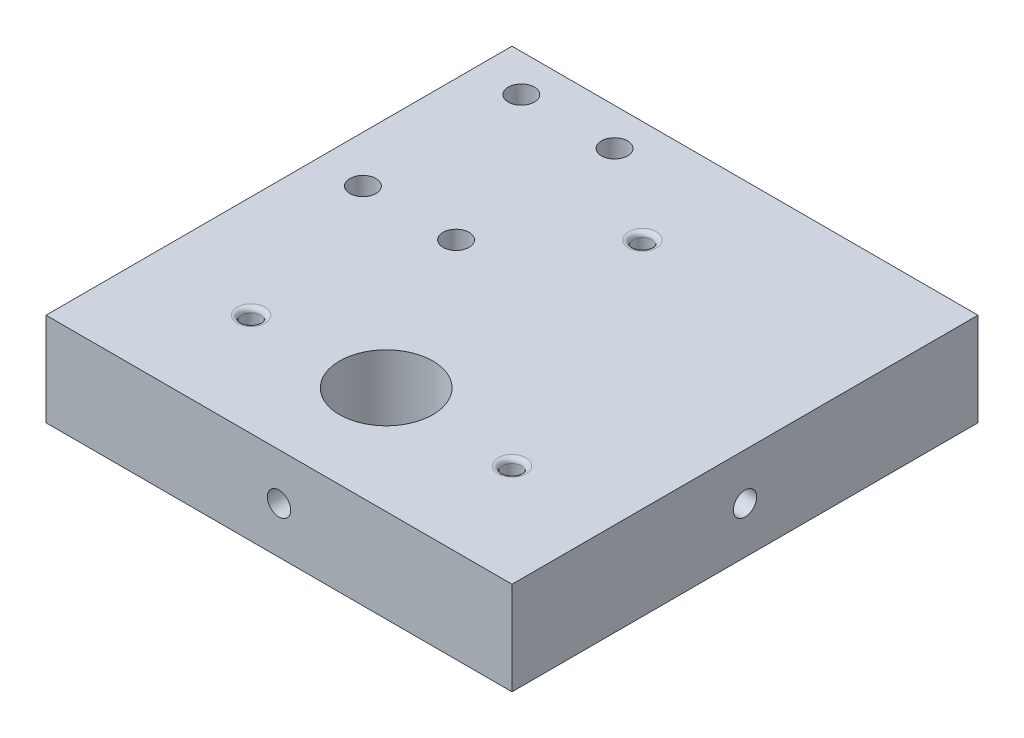
ISO-10303-21;
HEADER;
FILE_DESCRIPTION(('STEP AP214'),'2;1');
FILE_NAME('part.step','',(''),(''),'','','');
FILE_SCHEMA(('AUTOMOTIVE_DESIGN { 1 0 10303 214 1 1 1 1 }'));
ENDSEC;
DATA;
#1=APPLICATION_CONTEXT('core data for automotive mechanical design processes');
#2=APPLICATION_PROTOCOL_DEFINITION('international standard','automotive_design',2000,#1);
#3=PRODUCT_CONTEXT('',#1,'mechanical');
#4=PRODUCT('Part','Part','',(#3));
#5=PRODUCT_RELATED_PRODUCT_CATEGORY('part','',(#4));
#6=PRODUCT_DEFINITION_FORMATION('','',#4);
#7=PRODUCT_DEFINITION_CONTEXT('part definition',#1,'design');
#8=PRODUCT_DEFINITION('design','',#6,#7);
#9=PRODUCT_DEFINITION_SHAPE('','',#8);
#10=(LENGTH_UNIT() NAMED_UNIT(*) SI_UNIT(.MILLI.,.METRE.));
#11=(NAMED_UNIT(*) PLANE_ANGLE_UNIT() SI_UNIT($,.RADIAN.));
#12=(NAMED_UNIT(*) SI_UNIT($,.STERADIAN.) SOLID_ANGLE_UNIT());
#13=UNCERTAINTY_MEASURE_WITH_UNIT(LENGTH_MEASURE(1.E-05),#10,'distance_accuracy_value','');
#14=(GEOMETRIC_REPRESENTATION_CONTEXT(3) GLOBAL_UNCERTAINTY_ASSIGNED_CONTEXT((#13)) GLOBAL_UNIT_ASSIGNED_CONTEXT((#10,
#11,#12)) REPRESENTATION_CONTEXT('',''));
#15=CARTESIAN_POINT('',(0.,0.,0.));
#16=DIRECTION('',(0.,0.,1.));
#17=DIRECTION('',(1.,0.,0.));
#18=AXIS2_PLACEMENT_3D('',#15,#16,#17);
#19=CARTESIAN_POINT('',(0.,10.,0.));
#20=DIRECTION('',(1.,0.,0.));
#21=DIRECTION('',(0.,0.,-1.));
#22=AXIS2_PLACEMENT_3D('',#19,#20,#21);
#23=PLANE('',#22);
#24=CARTESIAN_POINT('',(0.,5.,-25.0002146716261));
#25=DIRECTION('',(-1.,0.,0.));
#26=DIRECTION('',(0.,0.,1.));
#27=AXIS2_PLACEMENT_3D('',#24,#25,#26);
#28=CIRCLE('',#27,1.25);
#29=CARTESIAN_POINT('',(0.,5.,-23.750214671626));
#30=VERTEX_POINT('',#29);
#31=EDGE_CURVE('E416',#30,#30,#28,.T.);
#32=ORIENTED_EDGE('',*,*,#31,.F.);
#33=EDGE_LOOP('',(#32));
#34=FACE_BOUND('',#33,.T.);
#35=DIRECTION('',(0.,0.,1.));
#36=VECTOR('',#35,1.);
#37=CARTESIAN_POINT('',(0.,0.,0.));
#38=LINE('',#37,#36);
#39=CARTESIAN_POINT('',(0.,0.,-50.));
#40=VERTEX_POINT('',#39);
#41=CARTESIAN_POINT('',(0.,0.,0.));
#42=VERTEX_POINT('',#41);
#43=EDGE_CURVE('E161',#40,#42,#38,.T.);
#44=ORIENTED_EDGE('',*,*,#43,.T.);
#45=DIRECTION('',(0.,-1.,0.));
#46=VECTOR('',#45,1.);
#47=CARTESIAN_POINT('',(0.,10.,0.));
#48=LINE('',#47,#46);
#49=CARTESIAN_POINT('',(0.,10.,0.));
#50=VERTEX_POINT('',#49);
#51=EDGE_CURVE('E184',#50,#42,#48,.T.);
#52=ORIENTED_EDGE('',*,*,#51,.F.);
#53=DIRECTION('',(0.,0.,1.));
#54=VECTOR('',#53,1.);
#55=CARTESIAN_POINT('',(0.,10.,0.));
#56=LINE('',#55,#54);
#57=CARTESIAN_POINT('',(0.,10.,-50.));
#58=VERTEX_POINT('',#57);
#59=EDGE_CURVE('E164',#58,#50,#56,.T.);
#60=ORIENTED_EDGE('',*,*,#59,.F.);
#61=DIRECTION('',(0.,-1.,0.));
#62=VECTOR('',#61,1.);
#63=CARTESIAN_POINT('',(0.,10.,-50.));
#64=LINE('',#63,#62);
#65=EDGE_CURVE('E170',#58,#40,#64,.T.);
#66=ORIENTED_EDGE('',*,*,#65,.T.);
#67=EDGE_LOOP('',(#44,#52,#60,#66));
#68=FACE_BOUND('',#67,.T.);
#69=ADVANCED_FACE('F36',(#34,#68),#23,.F.);
#70=CARTESIAN_POINT('',(0.,10.,0.));
#71=DIRECTION('',(0.,0.,-1.));
#72=DIRECTION('',(-1.,0.,0.));
#73=AXIS2_PLACEMENT_3D('',#70,#71,#72);
#74=PLANE('',#73);
#75=CARTESIAN_POINT('',(25.,5.,0.));
#76=DIRECTION('',(0.,0.,1.));
#77=DIRECTION('',(1.,0.,0.));
#78=AXIS2_PLACEMENT_3D('',#75,#76,#77);
#79=CIRCLE('',#78,1.25);
#80=CARTESIAN_POINT('',(26.25,5.,0.));
#81=VERTEX_POINT('',#80);
#82=EDGE_CURVE('E402',#81,#81,#79,.T.);
#83=ORIENTED_EDGE('',*,*,#82,.F.);
#84=EDGE_LOOP('',(#83));
#85=FACE_BOUND('',#84,.T.);
#86=DIRECTION('',(1.,0.,0.));
#87=VECTOR('',#86,1.);
#88=CARTESIAN_POINT('',(0.,0.,0.));
#89=LINE('',#88,#87);
#90=CARTESIAN_POINT('',(50.,0.,0.));
#91=VERTEX_POINT('',#90);
#92=EDGE_CURVE('E173',#42,#91,#89,.T.);
#93=ORIENTED_EDGE('',*,*,#92,.T.);
#94=DIRECTION('',(0.,-1.,0.));
#95=VECTOR('',#94,1.);
#96=CARTESIAN_POINT('',(50.,10.,0.));
#97=LINE('',#96,#95);
#98=CARTESIAN_POINT('',(50.,10.,0.));
#99=VERTEX_POINT('',#98);
#100=EDGE_CURVE('E181',#99,#91,#97,.T.);
#101=ORIENTED_EDGE('',*,*,#100,.F.);
#102=DIRECTION('',(1.,0.,0.));
#103=VECTOR('',#102,1.);
#104=CARTESIAN_POINT('',(0.,10.,0.));
#105=LINE('',#104,#103);
#106=EDGE_CURVE('E88',#50,#99,#105,.T.);
#107=ORIENTED_EDGE('',*,*,#106,.F.);
#108=ORIENTED_EDGE('',*,*,#51,.T.);
#109=EDGE_LOOP('',(#93,#101,#107,#108));
#110=FACE_BOUND('',#109,.T.);
#111=ADVANCED_FACE('F217',(#85,#110),#74,.F.);
#112=CARTESIAN_POINT('',(50.,10.,0.));
#113=DIRECTION('',(-1.,0.,0.));
#114=DIRECTION('',(0.,0.,1.));
#115=AXIS2_PLACEMENT_3D('',#112,#113,#114);
#116=PLANE('',#115);
#117=CARTESIAN_POINT('',(50.,5.,-25.0002146716261));
#118=DIRECTION('',(1.,0.,0.));
#119=DIRECTION('',(0.,0.,-1.));
#120=AXIS2_PLACEMENT_3D('',#117,#118,#119);
#121=CIRCLE('',#120,1.25);
#122=CARTESIAN_POINT('',(50.,5.,-26.2502146716261));
#123=VERTEX_POINT('',#122);
#124=EDGE_CURVE('E411',#123,#123,#121,.T.);
#125=ORIENTED_EDGE('',*,*,#124,.F.);
#126=EDGE_LOOP('',(#125));
#127=FACE_BOUND('',#126,.T.);
#128=DIRECTION('',(0.,0.,-1.));
#129=VECTOR('',#128,1.);
#130=CARTESIAN_POINT('',(50.,0.,0.));
#131=LINE('',#130,#129);
#132=CARTESIAN_POINT('',(50.,0.,-50.));
#133=VERTEX_POINT('',#132);
#134=EDGE_CURVE('E175',#91,#133,#131,.T.);
#135=ORIENTED_EDGE('',*,*,#134,.T.);
#136=DIRECTION('',(0.,-1.,0.));
#137=VECTOR('',#136,1.);
#138=CARTESIAN_POINT('',(50.,10.,-50.));
#139=LINE('',#138,#137);
#140=CARTESIAN_POINT('',(50.,10.,-50.));
#141=VERTEX_POINT('',#140);
#142=EDGE_CURVE('E179',#141,#133,#139,.T.);
#143=ORIENTED_EDGE('',*,*,#142,.F.);
#144=DIRECTION('',(0.,0.,-1.));
#145=VECTOR('',#144,1.);
#146=CARTESIAN_POINT('',(50.,10.,0.));
#147=LINE('',#146,#145);
#148=EDGE_CURVE('E167',#99,#141,#147,.T.);
#149=ORIENTED_EDGE('',*,*,#148,.F.);
#150=ORIENTED_EDGE('',*,*,#100,.T.);
#151=EDGE_LOOP('',(#135,#143,#149,#150));
#152=FACE_BOUND('',#151,.T.);
#153=ADVANCED_FACE('F223',(#127,#152),#116,.F.);
#154=CARTESIAN_POINT('',(0.,10.,-50.));
#155=DIRECTION('',(0.,0.,1.));
#156=DIRECTION('',(1.,0.,0.));
#157=AXIS2_PLACEMENT_3D('',#154,#155,#156);
#158=PLANE('',#157);
#159=CARTESIAN_POINT('',(25.,5.,-50.));
#160=DIRECTION('',(0.,0.,-1.));
#161=DIRECTION('',(-1.,0.,0.));
#162=AXIS2_PLACEMENT_3D('',#159,#160,#161);
#163=CIRCLE('',#162,1.25);
#164=CARTESIAN_POINT('',(23.75,5.,-50.));
#165=VERTEX_POINT('',#164);
#166=EDGE_CURVE('E401',#165,#165,#163,.T.);
#167=ORIENTED_EDGE('',*,*,#166,.F.);
#168=EDGE_LOOP('',(#167));
#169=FACE_BOUND('',#168,.T.);
#170=DIRECTION('',(-1.,0.,0.));
#171=VECTOR('',#170,1.);
#172=CARTESIAN_POINT('',(0.,0.,-50.));
#173=LINE('',#172,#171);
#174=EDGE_CURVE('E80',#133,#40,#173,.T.);
#175=ORIENTED_EDGE('',*,*,#174,.T.);
#176=ORIENTED_EDGE('',*,*,#65,.F.);
#177=DIRECTION('',(-1.,0.,0.));
#178=VECTOR('',#177,1.);
#179=CARTESIAN_POINT('',(0.,10.,-50.));
#180=LINE('',#179,#178);
#181=EDGE_CURVE('E59',#141,#58,#180,.T.);
#182=ORIENTED_EDGE('',*,*,#181,.F.);
#183=ORIENTED_EDGE('',*,*,#142,.T.);
#184=EDGE_LOOP('',(#175,#176,#182,#183));
#185=FACE_BOUND('',#184,.T.);
#186=ADVANCED_FACE('F231',(#169,#185),#158,.F.);
#187=CARTESIAN_POINT('',(0.,10.,0.));
#188=DIRECTION('',(0.,-1.,0.));
#189=DIRECTION('',(0.,0.,-1.));
#190=AXIS2_PLACEMENT_3D('',#187,#188,#189);
#191=PLANE('',#190);
#192=CARTESIAN_POINT('',(25.,10.,-39.));
#193=DIRECTION('',(0.,-1.,0.));
#194=DIRECTION('',(0.,0.,-1.));
#195=AXIS2_PLACEMENT_3D('',#192,#193,#194);
#196=CIRCLE('',#195,1.5);
#197=CARTESIAN_POINT('',(25.,10.,-40.5));
#198=VERTEX_POINT('',#197);
#199=EDGE_CURVE('E195',#198,#198,#196,.T.);
#200=ORIENTED_EDGE('',*,*,#199,.T.);
#201=EDGE_LOOP('',(#200));
#202=FACE_BOUND('',#201,.T.);
#203=CARTESIAN_POINT('',(11.,10.,-11.));
#204=DIRECTION('',(0.,-1.,0.));
#205=DIRECTION('',(0.,0.,-1.));
#206=AXIS2_PLACEMENT_3D('',#203,#204,#205);
#207=CIRCLE('',#206,1.5);
#208=CARTESIAN_POINT('',(11.,10.,-12.5));
#209=VERTEX_POINT('',#208);
#210=EDGE_CURVE('E192',#209,#209,#207,.T.);
#211=ORIENTED_EDGE('',*,*,#210,.T.);
#212=EDGE_LOOP('',(#211));
#213=FACE_BOUND('',#212,.T.);
#214=CARTESIAN_POINT('',(39.,10.,-11.));
#215=DIRECTION('',(0.,-1.,0.));
#216=DIRECTION('',(0.,0.,-1.));
#217=AXIS2_PLACEMENT_3D('',#214,#215,#216);
#218=CIRCLE('',#217,1.5);
#219=CARTESIAN_POINT('',(39.,10.,-12.5));
#220=VERTEX_POINT('',#219);
#221=EDGE_CURVE('E189',#220,#220,#218,.T.);
#222=ORIENTED_EDGE('',*,*,#221,.T.);
#223=EDGE_LOOP('',(#222));
#224=FACE_BOUND('',#223,.T.);
#225=CARTESIAN_POINT('',(5.,10.,-29.));
#226=DIRECTION('',(0.,1.,0.));
#227=DIRECTION('',(0.,0.,1.));
#228=AXIS2_PLACEMENT_3D('',#225,#226,#227);
#229=CIRCLE('',#228,1.4);
#230=CARTESIAN_POINT('',(5.,10.,-27.6));
#231=VERTEX_POINT('',#230);
#232=EDGE_CURVE('E451',#231,#231,#229,.T.);
#233=ORIENTED_EDGE('',*,*,#232,.F.);
#234=EDGE_LOOP('',(#233));
#235=FACE_BOUND('',#234,.T.);
#236=CARTESIAN_POINT('',(15.,10.,-46.));
#237=DIRECTION('',(0.,1.,0.));
#238=DIRECTION('',(0.,0.,1.));
#239=AXIS2_PLACEMENT_3D('',#236,#237,#238);
#240=CIRCLE('',#239,1.4);
#241=CARTESIAN_POINT('',(15.,10.,-44.6));
#242=VERTEX_POINT('',#241);
#243=EDGE_CURVE('E117',#242,#242,#240,.T.);
#244=ORIENTED_EDGE('',*,*,#243,.F.);
#245=EDGE_LOOP('',(#244));
#246=FACE_BOUND('',#245,.T.);
#247=CARTESIAN_POINT('',(5.,10.,-46.));
#248=DIRECTION('',(0.,1.,0.));
#249=DIRECTION('',(0.,0.,1.));
#250=AXIS2_PLACEMENT_3D('',#247,#248,#249);
#251=CIRCLE('',#250,1.4);
#252=CARTESIAN_POINT('',(5.,10.,-44.6));
#253=VERTEX_POINT('',#252);
#254=EDGE_CURVE('E103',#253,#253,#251,.T.);
#255=ORIENTED_EDGE('',*,*,#254,.F.);
#256=EDGE_LOOP('',(#255));
#257=FACE_BOUND('',#256,.T.);
#258=CARTESIAN_POINT('',(15.,10.,-29.));
#259=DIRECTION('',(0.,1.,0.));
#260=DIRECTION('',(0.,0.,1.));
#261=AXIS2_PLACEMENT_3D('',#258,#259,#260);
#262=CIRCLE('',#261,1.4);
#263=CARTESIAN_POINT('',(15.,10.,-27.6));
#264=VERTEX_POINT('',#263);
#265=EDGE_CURVE('E107',#264,#264,#262,.T.);
#266=ORIENTED_EDGE('',*,*,#265,.F.);
#267=EDGE_LOOP('',(#266));
#268=FACE_BOUND('',#267,.T.);
#269=CARTESIAN_POINT('',(25.,10.,-11.5));
#270=DIRECTION('',(0.,-1.,0.));
#271=DIRECTION('',(0.,0.,-1.));
#272=AXIS2_PLACEMENT_3D('',#269,#270,#271);
#273=CIRCLE('',#272,5.);
#274=CARTESIAN_POINT('',(25.,10.,-16.5));
#275=VERTEX_POINT('',#274);
#276=EDGE_CURVE('E152',#275,#275,#273,.T.);
#277=ORIENTED_EDGE('',*,*,#276,.T.);
#278=EDGE_LOOP('',(#277));
#279=FACE_BOUND('',#278,.T.);
#280=ORIENTED_EDGE('',*,*,#59,.T.);
#281=ORIENTED_EDGE('',*,*,#106,.T.);
#282=ORIENTED_EDGE('',*,*,#148,.T.);
#283=ORIENTED_EDGE('',*,*,#181,.T.);
#284=EDGE_LOOP('',(#280,#281,#282,#283));
#285=FACE_BOUND('',#284,.T.);
#286=ADVANCED_FACE('F235',(#202,#213,#224,#235,#246,#257,#268,#279,#285),#191,.F.);
#287=CARTESIAN_POINT('',(0.,0.,0.));
#288=DIRECTION('',(0.,-1.,0.));
#289=DIRECTION('',(0.,0.,-1.));
#290=AXIS2_PLACEMENT_3D('',#287,#288,#289);
#291=PLANE('',#290);
#292=CARTESIAN_POINT('',(32.5,0.,-29.));
#293=DIRECTION('',(0.,-1.,0.));
#294=DIRECTION('',(0.,0.,-1.));
#295=AXIS2_PLACEMENT_3D('',#292,#293,#294);
#296=CIRCLE('',#295,1.25);
#297=CARTESIAN_POINT('',(32.5,0.,-30.25));
#298=VERTEX_POINT('',#297);
#299=EDGE_CURVE('E434',#298,#298,#296,.T.);
#300=ORIENTED_EDGE('',*,*,#299,.F.);
#301=EDGE_LOOP('',(#300));
#302=FACE_BOUND('',#301,.T.);
#303=CARTESIAN_POINT('',(17.5,0.,-45.));
#304=DIRECTION('',(0.,-1.,0.));
#305=DIRECTION('',(0.,0.,-1.));
#306=AXIS2_PLACEMENT_3D('',#303,#304,#305);
#307=CIRCLE('',#306,1.25);
#308=CARTESIAN_POINT('',(17.5,0.,-46.25));
#309=VERTEX_POINT('',#308);
#310=EDGE_CURVE('E428',#309,#309,#307,.T.);
#311=ORIENTED_EDGE('',*,*,#310,.F.);
#312=EDGE_LOOP('',(#311));
#313=FACE_BOUND('',#312,.T.);
#314=CARTESIAN_POINT('',(32.5,0.,-45.));
#315=DIRECTION('',(0.,-1.,0.));
#316=DIRECTION('',(0.,0.,-1.));
#317=AXIS2_PLACEMENT_3D('',#314,#315,#316);
#318=CIRCLE('',#317,1.25);
#319=CARTESIAN_POINT('',(32.5,0.,-46.25));
#320=VERTEX_POINT('',#319);
#321=EDGE_CURVE('E422',#320,#320,#318,.T.);
#322=ORIENTED_EDGE('',*,*,#321,.F.);
#323=EDGE_LOOP('',(#322));
#324=FACE_BOUND('',#323,.T.);
#325=CARTESIAN_POINT('',(17.5,0.,-29.));
#326=DIRECTION('',(0.,-1.,0.));
#327=DIRECTION('',(0.,0.,-1.));
#328=AXIS2_PLACEMENT_3D('',#325,#326,#327);
#329=CIRCLE('',#328,1.25);
#330=CARTESIAN_POINT('',(17.5,0.,-30.25));
#331=VERTEX_POINT('',#330);
#332=EDGE_CURVE('E96',#331,#331,#329,.T.);
#333=ORIENTED_EDGE('',*,*,#332,.F.);
#334=EDGE_LOOP('',(#333));
#335=FACE_BOUND('',#334,.T.);
#336=CARTESIAN_POINT('',(40.,0.,-4.6));
#337=DIRECTION('',(0.,-1.,0.));
#338=DIRECTION('',(0.,0.,-1.));
#339=AXIS2_PLACEMENT_3D('',#336,#337,#338);
#340=CIRCLE('',#339,1.25);
#341=CARTESIAN_POINT('',(40.,0.,-5.85));
#342=VERTEX_POINT('',#341);
#343=EDGE_CURVE('E129',#342,#342,#340,.T.);
#344=ORIENTED_EDGE('',*,*,#343,.F.);
#345=EDGE_LOOP('',(#344));
#346=FACE_BOUND('',#345,.T.);
#347=CARTESIAN_POINT('',(10.,0.,-18.4));
#348=DIRECTION('',(0.,-1.,0.));
#349=DIRECTION('',(0.,0.,-1.));
#350=AXIS2_PLACEMENT_3D('',#347,#348,#349);
#351=CIRCLE('',#350,1.25);
#352=CARTESIAN_POINT('',(10.,0.,-19.65));
#353=VERTEX_POINT('',#352);
#354=EDGE_CURVE('E123',#353,#353,#351,.T.);
#355=ORIENTED_EDGE('',*,*,#354,.F.);
#356=EDGE_LOOP('',(#355));
#357=FACE_BOUND('',#356,.T.);
#358=CARTESIAN_POINT('',(10.,0.,-4.6));
#359=DIRECTION('',(0.,-1.,0.));
#360=DIRECTION('',(0.,0.,-1.));
#361=AXIS2_PLACEMENT_3D('',#358,#359,#360);
#362=CIRCLE('',#361,1.25);
#363=CARTESIAN_POINT('',(10.,0.,-5.85));
#364=VERTEX_POINT('',#363);
#365=EDGE_CURVE('E111',#364,#364,#362,.T.);
#366=ORIENTED_EDGE('',*,*,#365,.F.);
#367=EDGE_LOOP('',(#366));
#368=FACE_BOUND('',#367,.T.);
#369=CARTESIAN_POINT('',(40.,0.,-18.4));
#370=DIRECTION('',(0.,-1.,0.));
#371=DIRECTION('',(0.,0.,-1.));
#372=AXIS2_PLACEMENT_3D('',#369,#370,#371);
#373=CIRCLE('',#372,1.25);
#374=CARTESIAN_POINT('',(40.,0.,-19.65));
#375=VERTEX_POINT('',#374);
#376=EDGE_CURVE('E128',#375,#375,#373,.T.);
#377=ORIENTED_EDGE('',*,*,#376,.F.);
#378=EDGE_LOOP('',(#377));
#379=FACE_BOUND('',#378,.T.);
#380=CARTESIAN_POINT('',(25.,0.,-11.5));
#381=DIRECTION('',(0.,-1.,0.));
#382=DIRECTION('',(0.,0.,-1.));
#383=AXIS2_PLACEMENT_3D('',#380,#381,#382);
#384=CIRCLE('',#383,10.1);
#385=CARTESIAN_POINT('',(25.,0.,-21.6));
#386=VERTEX_POINT('',#385);
#387=EDGE_CURVE('E155',#386,#386,#384,.T.);
#388=ORIENTED_EDGE('',*,*,#387,.F.);
#389=EDGE_LOOP('',(#388));
#390=FACE_BOUND('',#389,.T.);
#391=ORIENTED_EDGE('',*,*,#43,.F.);
#392=ORIENTED_EDGE('',*,*,#174,.F.);
#393=ORIENTED_EDGE('',*,*,#134,.F.);
#394=ORIENTED_EDGE('',*,*,#92,.F.);
#395=EDGE_LOOP('',(#391,#392,#393,#394));
#396=FACE_BOUND('',#395,.T.);
#397=ADVANCED_FACE('F237',(#302,#313,#324,#335,#346,#357,#368,#379,#390,#396),#291,.T.);
#398=CARTESIAN_POINT('',(25.,2.,-11.5));
#399=DIRECTION('',(0.,-1.,0.));
#400=DIRECTION('',(0.,0.,-1.));
#401=AXIS2_PLACEMENT_3D('',#398,#399,#400);
#402=CYLINDRICAL_SURFACE('',#401,10.1);
#403=CARTESIAN_POINT('',(25.,2.,-11.5));
#404=DIRECTION('',(0.,-1.,0.));
#405=DIRECTION('',(0.,0.,-1.));
#406=AXIS2_PLACEMENT_3D('',#403,#404,#405);
#407=CIRCLE('',#406,10.1);
#408=CARTESIAN_POINT('',(25.,2.,-21.6));
#409=VERTEX_POINT('',#408);
#410=EDGE_CURVE('E158',#409,#409,#407,.T.);
#411=ORIENTED_EDGE('',*,*,#410,.F.);
#412=EDGE_LOOP('',(#411));
#413=FACE_BOUND('',#412,.T.);
#414=ORIENTED_EDGE('',*,*,#387,.T.);
#415=EDGE_LOOP('',(#414));
#416=FACE_BOUND('',#415,.T.);
#417=ADVANCED_FACE('F240',(#413,#416),#402,.F.);
#418=CARTESIAN_POINT('',(25.,2.,-11.5));
#419=DIRECTION('',(0.,-1.,0.));
#420=DIRECTION('',(0.,0.,-1.));
#421=AXIS2_PLACEMENT_3D('',#418,#419,#420);
#422=PLANE('',#421);
#423=CARTESIAN_POINT('',(25.,2.,-11.5));
#424=DIRECTION('',(0.,-1.,0.));
#425=DIRECTION('',(0.,0.,-1.));
#426=AXIS2_PLACEMENT_3D('',#423,#424,#425);
#427=CIRCLE('',#426,5.);
#428=CARTESIAN_POINT('',(25.,2.,-16.5));
#429=VERTEX_POINT('',#428);
#430=EDGE_CURVE('E146',#429,#429,#427,.T.);
#431=ORIENTED_EDGE('',*,*,#430,.F.);
#432=EDGE_LOOP('',(#431));
#433=FACE_BOUND('',#432,.T.);
#434=ORIENTED_EDGE('',*,*,#410,.T.);
#435=EDGE_LOOP('',(#434));
#436=FACE_BOUND('',#435,.T.);
#437=ADVANCED_FACE('F247',(#433,#436),#422,.T.);
#438=CARTESIAN_POINT('',(25.,10.,-11.5));
#439=DIRECTION('',(0.,-1.,0.));
#440=DIRECTION('',(0.,0.,-1.));
#441=AXIS2_PLACEMENT_3D('',#438,#439,#440);
#442=CYLINDRICAL_SURFACE('',#441,5.);
#443=ORIENTED_EDGE('',*,*,#276,.F.);
#444=EDGE_LOOP('',(#443));
#445=FACE_BOUND('',#444,.T.);
#446=ORIENTED_EDGE('',*,*,#430,.T.);
#447=EDGE_LOOP('',(#446));
#448=FACE_BOUND('',#447,.T.);
#449=ADVANCED_FACE('F251',(#445,#448),#442,.F.);
#450=CARTESIAN_POINT('',(39.,8.,-11.));
#451=DIRECTION('',(0.,1.,0.));
#452=DIRECTION('',(0.,0.,1.));
#453=AXIS2_PLACEMENT_3D('',#450,#451,#452);
#454=CYLINDRICAL_SURFACE('',#453,0.999999999999998);
#455=CARTESIAN_POINT('',(39.,9.5,-11.));
#456=DIRECTION('',(0.,-1.,0.));
#457=DIRECTION('',(0.,0.,-1.));
#458=AXIS2_PLACEMENT_3D('',#455,#456,#457);
#459=CIRCLE('',#458,0.999999999999998);
#460=CARTESIAN_POINT('',(39.,9.5,-12.));
#461=VERTEX_POINT('',#460);
#462=EDGE_CURVE('E11',#461,#461,#459,.F.);
#463=ORIENTED_EDGE('',*,*,#462,.T.);
#464=EDGE_LOOP('',(#463));
#465=FACE_BOUND('',#464,.T.);
#466=CARTESIAN_POINT('',(39.,8.,-11.));
#467=DIRECTION('',(0.,1.,0.));
#468=DIRECTION('',(0.,0.,1.));
#469=AXIS2_PLACEMENT_3D('',#466,#467,#468);
#470=CIRCLE('',#469,0.999999999999998);
#471=CARTESIAN_POINT('',(39.,8.,-10.));
#472=VERTEX_POINT('',#471);
#473=EDGE_CURVE('E140',#472,#472,#470,.T.);
#474=ORIENTED_EDGE('',*,*,#473,.F.);
#475=EDGE_LOOP('',(#474));
#476=FACE_BOUND('',#475,.T.);
#477=ADVANCED_FACE('F255',(#465,#476),#454,.F.);
#478=CARTESIAN_POINT('',(39.,8.,-11.));
#479=DIRECTION('',(0.,1.,0.));
#480=DIRECTION('',(0.,0.,1.));
#481=AXIS2_PLACEMENT_3D('',#478,#479,#480);
#482=PLANE('',#481);
#483=ORIENTED_EDGE('',*,*,#473,.T.);
#484=EDGE_LOOP('',(#483));
#485=FACE_BOUND('',#484,.T.);
#486=ADVANCED_FACE('F259',(#485),#482,.T.);
#487=CARTESIAN_POINT('',(11.,8.,-11.));
#488=DIRECTION('',(0.,1.,0.));
#489=DIRECTION('',(0.,0.,1.));
#490=AXIS2_PLACEMENT_3D('',#487,#488,#489);
#491=CYLINDRICAL_SURFACE('',#490,1.);
#492=CARTESIAN_POINT('',(11.,9.5,-11.));
#493=DIRECTION('',(0.,-1.,0.));
#494=DIRECTION('',(0.,0.,-1.));
#495=AXIS2_PLACEMENT_3D('',#492,#493,#494);
#496=CIRCLE('',#495,1.);
#497=CARTESIAN_POINT('',(11.,9.5,-12.));
#498=VERTEX_POINT('',#497);
#499=EDGE_CURVE('E44',#498,#498,#496,.F.);
#500=ORIENTED_EDGE('',*,*,#499,.T.);
#501=EDGE_LOOP('',(#500));
#502=FACE_BOUND('',#501,.T.);
#503=CARTESIAN_POINT('',(11.,8.,-11.));
#504=DIRECTION('',(0.,1.,0.));
#505=DIRECTION('',(0.,0.,1.));
#506=AXIS2_PLACEMENT_3D('',#503,#504,#505);
#507=CIRCLE('',#506,1.);
#508=CARTESIAN_POINT('',(11.,8.,-10.));
#509=VERTEX_POINT('',#508);
#510=EDGE_CURVE('E147',#509,#509,#507,.T.);
#511=ORIENTED_EDGE('',*,*,#510,.F.);
#512=EDGE_LOOP('',(#511));
#513=FACE_BOUND('',#512,.T.);
#514=ADVANCED_FACE('F200',(#502,#513),#491,.F.);
#515=CARTESIAN_POINT('',(11.,8.,-11.));
#516=DIRECTION('',(0.,1.,0.));
#517=DIRECTION('',(0.,0.,1.));
#518=AXIS2_PLACEMENT_3D('',#515,#516,#517);
#519=PLANE('',#518);
#520=ORIENTED_EDGE('',*,*,#510,.T.);
#521=EDGE_LOOP('',(#520));
#522=FACE_BOUND('',#521,.T.);
#523=ADVANCED_FACE('F266',(#522),#519,.T.);
#524=CARTESIAN_POINT('',(25.,8.,-39.));
#525=DIRECTION('',(0.,1.,0.));
#526=DIRECTION('',(0.,0.,1.));
#527=AXIS2_PLACEMENT_3D('',#524,#525,#526);
#528=CYLINDRICAL_SURFACE('',#527,1.);
#529=CARTESIAN_POINT('',(25.,9.5,-39.));
#530=DIRECTION('',(0.,-1.,0.));
#531=DIRECTION('',(0.,0.,-1.));
#532=AXIS2_PLACEMENT_3D('',#529,#530,#531);
#533=CIRCLE('',#532,1.);
#534=CARTESIAN_POINT('',(25.,9.5,-40.));
#535=VERTEX_POINT('',#534);
#536=EDGE_CURVE('E186',#535,#535,#533,.F.);
#537=ORIENTED_EDGE('',*,*,#536,.T.);
#538=EDGE_LOOP('',(#537));
#539=FACE_BOUND('',#538,.T.);
#540=CARTESIAN_POINT('',(25.,8.,-39.));
#541=DIRECTION('',(0.,1.,0.));
#542=DIRECTION('',(0.,0.,1.));
#543=AXIS2_PLACEMENT_3D('',#540,#541,#542);
#544=CIRCLE('',#543,1.);
#545=CARTESIAN_POINT('',(25.,8.,-38.));
#546=VERTEX_POINT('',#545);
#547=EDGE_CURVE('E143',#546,#546,#544,.T.);
#548=ORIENTED_EDGE('',*,*,#547,.F.);
#549=EDGE_LOOP('',(#548));
#550=FACE_BOUND('',#549,.T.);
#551=ADVANCED_FACE('F269',(#539,#550),#528,.F.);
#552=CARTESIAN_POINT('',(25.,8.,-39.));
#553=DIRECTION('',(0.,1.,0.));
#554=DIRECTION('',(0.,0.,1.));
#555=AXIS2_PLACEMENT_3D('',#552,#553,#554);
#556=PLANE('',#555);
#557=ORIENTED_EDGE('',*,*,#547,.T.);
#558=EDGE_LOOP('',(#557));
#559=FACE_BOUND('',#558,.T.);
#560=ADVANCED_FACE('F273',(#559),#556,.T.);
#561=CARTESIAN_POINT('',(40.,8.,-18.4));
#562=DIRECTION('',(0.,-1.,0.));
#563=DIRECTION('',(0.,0.,-1.));
#564=AXIS2_PLACEMENT_3D('',#561,#562,#563);
#565=CYLINDRICAL_SURFACE('',#564,1.25);
#566=CARTESIAN_POINT('',(40.,8.,-18.4));
#567=DIRECTION('',(0.,-1.,0.));
#568=DIRECTION('',(0.,0.,-1.));
#569=AXIS2_PLACEMENT_3D('',#566,#567,#568);
#570=CIRCLE('',#569,1.25);
#571=CARTESIAN_POINT('',(40.,8.,-19.65));
#572=VERTEX_POINT('',#571);
#573=EDGE_CURVE('E137',#572,#572,#570,.T.);
#574=ORIENTED_EDGE('',*,*,#573,.F.);
#575=EDGE_LOOP('',(#574));
#576=FACE_BOUND('',#575,.T.);
#577=ORIENTED_EDGE('',*,*,#376,.T.);
#578=EDGE_LOOP('',(#577));
#579=FACE_BOUND('',#578,.T.);
#580=ADVANCED_FACE('F277',(#576,#579),#565,.F.);
#581=CARTESIAN_POINT('',(40.,8.,-18.4));
#582=DIRECTION('',(0.,-1.,0.));
#583=DIRECTION('',(0.,0.,-1.));
#584=AXIS2_PLACEMENT_3D('',#581,#582,#583);
#585=PLANE('',#584);
#586=ORIENTED_EDGE('',*,*,#573,.T.);
#587=EDGE_LOOP('',(#586));
#588=FACE_BOUND('',#587,.T.);
#589=ADVANCED_FACE('F281',(#588),#585,.T.);
#590=CARTESIAN_POINT('',(10.,8.,-4.6));
#591=DIRECTION('',(0.,-1.,0.));
#592=DIRECTION('',(0.,0.,-1.));
#593=AXIS2_PLACEMENT_3D('',#590,#591,#592);
#594=CYLINDRICAL_SURFACE('',#593,1.25);
#595=CARTESIAN_POINT('',(10.,8.,-4.6));
#596=DIRECTION('',(0.,-1.,0.));
#597=DIRECTION('',(0.,0.,-1.));
#598=AXIS2_PLACEMENT_3D('',#595,#596,#597);
#599=CIRCLE('',#598,1.25);
#600=CARTESIAN_POINT('',(10.,8.,-5.85));
#601=VERTEX_POINT('',#600);
#602=EDGE_CURVE('E113',#601,#601,#599,.T.);
#603=ORIENTED_EDGE('',*,*,#602,.F.);
#604=EDGE_LOOP('',(#603));
#605=FACE_BOUND('',#604,.T.);
#606=ORIENTED_EDGE('',*,*,#365,.T.);
#607=EDGE_LOOP('',(#606));
#608=FACE_BOUND('',#607,.T.);
#609=ADVANCED_FACE('F285',(#605,#608),#594,.F.);
#610=CARTESIAN_POINT('',(10.,8.,-4.6));
#611=DIRECTION('',(0.,-1.,0.));
#612=DIRECTION('',(0.,0.,-1.));
#613=AXIS2_PLACEMENT_3D('',#610,#611,#612);
#614=PLANE('',#613);
#615=ORIENTED_EDGE('',*,*,#602,.T.);
#616=EDGE_LOOP('',(#615));
#617=FACE_BOUND('',#616,.T.);
#618=ADVANCED_FACE('F291',(#617),#614,.T.);
#619=CARTESIAN_POINT('',(10.,8.,-18.4));
#620=DIRECTION('',(0.,-1.,0.));
#621=DIRECTION('',(0.,0.,-1.));
#622=AXIS2_PLACEMENT_3D('',#619,#620,#621);
#623=CYLINDRICAL_SURFACE('',#622,1.25);
#624=CARTESIAN_POINT('',(10.,8.,-18.4));
#625=DIRECTION('',(0.,-1.,0.));
#626=DIRECTION('',(0.,0.,-1.));
#627=AXIS2_PLACEMENT_3D('',#624,#625,#626);
#628=CIRCLE('',#627,1.25);
#629=CARTESIAN_POINT('',(10.,8.,-19.65));
#630=VERTEX_POINT('',#629);
#631=EDGE_CURVE('E132',#630,#630,#628,.T.);
#632=ORIENTED_EDGE('',*,*,#631,.F.);
#633=EDGE_LOOP('',(#632));
#634=FACE_BOUND('',#633,.T.);
#635=ORIENTED_EDGE('',*,*,#354,.T.);
#636=EDGE_LOOP('',(#635));
#637=FACE_BOUND('',#636,.T.);
#638=ADVANCED_FACE('F287',(#634,#637),#623,.F.);
#639=CARTESIAN_POINT('',(10.,8.,-18.4));
#640=DIRECTION('',(0.,-1.,0.));
#641=DIRECTION('',(0.,0.,-1.));
#642=AXIS2_PLACEMENT_3D('',#639,#640,#641);
#643=PLANE('',#642);
#644=ORIENTED_EDGE('',*,*,#631,.T.);
#645=EDGE_LOOP('',(#644));
#646=FACE_BOUND('',#645,.T.);
#647=ADVANCED_FACE('F290',(#646),#643,.T.);
#648=CARTESIAN_POINT('',(40.,8.,-4.6));
#649=DIRECTION('',(0.,-1.,0.));
#650=DIRECTION('',(0.,0.,-1.));
#651=AXIS2_PLACEMENT_3D('',#648,#649,#650);
#652=CYLINDRICAL_SURFACE('',#651,1.25);
#653=CARTESIAN_POINT('',(40.,8.,-4.6));
#654=DIRECTION('',(0.,-1.,0.));
#655=DIRECTION('',(0.,0.,-1.));
#656=AXIS2_PLACEMENT_3D('',#653,#654,#655);
#657=CIRCLE('',#656,1.25);
#658=CARTESIAN_POINT('',(40.,8.,-5.85));
#659=VERTEX_POINT('',#658);
#660=EDGE_CURVE('E125',#659,#659,#657,.T.);
#661=ORIENTED_EDGE('',*,*,#660,.F.);
#662=EDGE_LOOP('',(#661));
#663=FACE_BOUND('',#662,.T.);
#664=ORIENTED_EDGE('',*,*,#343,.T.);
#665=EDGE_LOOP('',(#664));
#666=FACE_BOUND('',#665,.T.);
#667=ADVANCED_FACE('F295',(#663,#666),#652,.F.);
#668=CARTESIAN_POINT('',(40.,8.,-4.6));
#669=DIRECTION('',(0.,-1.,0.));
#670=DIRECTION('',(0.,0.,-1.));
#671=AXIS2_PLACEMENT_3D('',#668,#669,#670);
#672=PLANE('',#671);
#673=ORIENTED_EDGE('',*,*,#660,.T.);
#674=EDGE_LOOP('',(#673));
#675=FACE_BOUND('',#674,.T.);
#676=ADVANCED_FACE('F299',(#675),#672,.T.);
#677=CARTESIAN_POINT('',(15.,5.,-29.));
#678=DIRECTION('',(0.,1.,0.));
#679=DIRECTION('',(0.,0.,1.));
#680=AXIS2_PLACEMENT_3D('',#677,#678,#679);
#681=CYLINDRICAL_SURFACE('',#680,1.4);
#682=CARTESIAN_POINT('',(15.,5.,-29.));
#683=DIRECTION('',(0.,1.,0.));
#684=DIRECTION('',(0.,0.,1.));
#685=AXIS2_PLACEMENT_3D('',#682,#683,#684);
#686=CIRCLE('',#685,1.4);
#687=CARTESIAN_POINT('',(16.3295,5.,-28.5613318452406));
#688=VERTEX_POINT('',#687);
#689=CARTESIAN_POINT('',(16.3295,5.,-29.4386681547594));
#690=VERTEX_POINT('',#689);
#691=EDGE_CURVE('E93',#688,#690,#686,.T.);
#692=ORIENTED_EDGE('',*,*,#691,.F.);
#693=EDGE_CURVE('E104',#690,#688,#686,.T.);
#694=ORIENTED_EDGE('',*,*,#693,.F.);
#695=EDGE_LOOP('',(#692,#694));
#696=FACE_BOUND('',#695,.T.);
#697=ORIENTED_EDGE('',*,*,#265,.T.);
#698=EDGE_LOOP('',(#697));
#699=FACE_BOUND('',#698,.T.);
#700=ADVANCED_FACE('F109',(#696,#699),#681,.F.);
#701=CARTESIAN_POINT('',(15.,5.,-29.));
#702=DIRECTION('',(0.,1.,0.));
#703=DIRECTION('',(0.,0.,1.));
#704=AXIS2_PLACEMENT_3D('',#701,#702,#703);
#705=PLANE('',#704);
#706=ORIENTED_EDGE('',*,*,#693,.T.);
#707=CARTESIAN_POINT('',(17.5,5.,-29.));
#708=DIRECTION('',(0.,-1.,0.));
#709=DIRECTION('',(0.,0.,-1.));
#710=AXIS2_PLACEMENT_3D('',#707,#708,#709);
#711=CIRCLE('',#710,1.25);
#712=EDGE_CURVE('E95',#688,#690,#711,.T.);
#713=ORIENTED_EDGE('',*,*,#712,.T.);
#714=EDGE_LOOP('',(#706,#713));
#715=FACE_BOUND('',#714,.T.);
#716=ADVANCED_FACE('F105',(#715),#705,.T.);
#717=CARTESIAN_POINT('',(5.,5.,-46.));
#718=DIRECTION('',(0.,1.,0.));
#719=DIRECTION('',(0.,0.,1.));
#720=AXIS2_PLACEMENT_3D('',#717,#718,#719);
#721=CYLINDRICAL_SURFACE('',#720,1.4);
#722=CARTESIAN_POINT('',(5.,5.,-46.));
#723=DIRECTION('',(0.,1.,0.));
#724=DIRECTION('',(0.,0.,1.));
#725=AXIS2_PLACEMENT_3D('',#722,#723,#724);
#726=CIRCLE('',#725,1.4);
#727=CARTESIAN_POINT('',(5.,5.,-44.6));
#728=VERTEX_POINT('',#727);
#729=EDGE_CURVE('E444',#728,#728,#726,.T.);
#730=ORIENTED_EDGE('',*,*,#729,.F.);
#731=EDGE_LOOP('',(#730));
#732=FACE_BOUND('',#731,.T.);
#733=ORIENTED_EDGE('',*,*,#254,.T.);
#734=EDGE_LOOP('',(#733));
#735=FACE_BOUND('',#734,.T.);
#736=ADVANCED_FACE('F314',(#732,#735),#721,.F.);
#737=CARTESIAN_POINT('',(5.,5.,-46.));
#738=DIRECTION('',(0.,1.,0.));
#739=DIRECTION('',(0.,0.,1.));
#740=AXIS2_PLACEMENT_3D('',#737,#738,#739);
#741=PLANE('',#740);
#742=ORIENTED_EDGE('',*,*,#729,.T.);
#743=EDGE_LOOP('',(#742));
#744=FACE_BOUND('',#743,.T.);
#745=ADVANCED_FACE('F319',(#744),#741,.T.);
#746=CARTESIAN_POINT('',(15.,5.,-46.));
#747=DIRECTION('',(0.,1.,0.));
#748=DIRECTION('',(0.,0.,1.));
#749=AXIS2_PLACEMENT_3D('',#746,#747,#748);
#750=CYLINDRICAL_SURFACE('',#749,1.4);
#751=CARTESIAN_POINT('',(15.,5.,-46.));
#752=DIRECTION('',(0.,1.,0.));
#753=DIRECTION('',(0.,0.,1.));
#754=AXIS2_PLACEMENT_3D('',#751,#752,#753);
#755=CIRCLE('',#754,1.4);
#756=CARTESIAN_POINT('',(15.,5.,-44.6));
#757=VERTEX_POINT('',#756);
#758=EDGE_CURVE('E453',#757,#757,#755,.T.);
#759=ORIENTED_EDGE('',*,*,#758,.F.);
#760=EDGE_LOOP('',(#759));
#761=FACE_BOUND('',#760,.T.);
#762=ORIENTED_EDGE('',*,*,#243,.T.);
#763=EDGE_LOOP('',(#762));
#764=FACE_BOUND('',#763,.T.);
#765=ADVANCED_FACE('F315',(#761,#764),#750,.F.);
#766=CARTESIAN_POINT('',(15.,5.,-46.));
#767=DIRECTION('',(0.,1.,0.));
#768=DIRECTION('',(0.,0.,1.));
#769=AXIS2_PLACEMENT_3D('',#766,#767,#768);
#770=PLANE('',#769);
#771=ORIENTED_EDGE('',*,*,#758,.T.);
#772=EDGE_LOOP('',(#771));
#773=FACE_BOUND('',#772,.T.);
#774=ADVANCED_FACE('F318',(#773),#770,.T.);
#775=CARTESIAN_POINT('',(5.,5.,-29.));
#776=DIRECTION('',(0.,1.,0.));
#777=DIRECTION('',(0.,0.,1.));
#778=AXIS2_PLACEMENT_3D('',#775,#776,#777);
#779=CYLINDRICAL_SURFACE('',#778,1.4);
#780=CARTESIAN_POINT('',(5.,5.,-29.));
#781=DIRECTION('',(0.,1.,0.));
#782=DIRECTION('',(0.,0.,1.));
#783=AXIS2_PLACEMENT_3D('',#780,#781,#782);
#784=CIRCLE('',#783,1.4);
#785=CARTESIAN_POINT('',(5.,5.,-27.6));
#786=VERTEX_POINT('',#785);
#787=EDGE_CURVE('E121',#786,#786,#784,.T.);
#788=ORIENTED_EDGE('',*,*,#787,.F.);
#789=EDGE_LOOP('',(#788));
#790=FACE_BOUND('',#789,.T.);
#791=ORIENTED_EDGE('',*,*,#232,.T.);
#792=EDGE_LOOP('',(#791));
#793=FACE_BOUND('',#792,.T.);
#794=ADVANCED_FACE('F323',(#790,#793),#779,.F.);
#795=CARTESIAN_POINT('',(5.,5.,-29.));
#796=DIRECTION('',(0.,1.,0.));
#797=DIRECTION('',(0.,0.,1.));
#798=AXIS2_PLACEMENT_3D('',#795,#796,#797);
#799=PLANE('',#798);
#800=ORIENTED_EDGE('',*,*,#787,.T.);
#801=EDGE_LOOP('',(#800));
#802=FACE_BOUND('',#801,.T.);
#803=ADVANCED_FACE('F212',(#802),#799,.T.);
#804=CARTESIAN_POINT('',(25.,9.5,-39.));
#805=DIRECTION('',(0.,-1.,0.));
#806=DIRECTION('',(0.,0.,-1.));
#807=AXIS2_PLACEMENT_3D('',#804,#805,#806);
#808=TOROIDAL_SURFACE('',#807,1.5,0.5);
#809=ORIENTED_EDGE('',*,*,#199,.F.);
#810=EDGE_LOOP('',(#809));
#811=FACE_BOUND('',#810,.T.);
#812=ORIENTED_EDGE('',*,*,#536,.F.);
#813=EDGE_LOOP('',(#812));
#814=FACE_BOUND('',#813,.T.);
#815=ADVANCED_FACE('F205',(#811,#814),#808,.T.);
#816=CARTESIAN_POINT('',(11.,9.5,-11.));
#817=DIRECTION('',(0.,-1.,0.));
#818=DIRECTION('',(0.,0.,-1.));
#819=AXIS2_PLACEMENT_3D('',#816,#817,#818);
#820=TOROIDAL_SURFACE('',#819,1.5,0.5);
#821=ORIENTED_EDGE('',*,*,#210,.F.);
#822=EDGE_LOOP('',(#821));
#823=FACE_BOUND('',#822,.T.);
#824=ORIENTED_EDGE('',*,*,#499,.F.);
#825=EDGE_LOOP('',(#824));
#826=FACE_BOUND('',#825,.T.);
#827=ADVANCED_FACE('F203',(#823,#826),#820,.T.);
#828=CARTESIAN_POINT('',(39.,9.5,-11.));
#829=DIRECTION('',(0.,-1.,0.));
#830=DIRECTION('',(0.,0.,-1.));
#831=AXIS2_PLACEMENT_3D('',#828,#829,#830);
#832=TOROIDAL_SURFACE('',#831,1.5,0.5);
#833=ORIENTED_EDGE('',*,*,#221,.F.);
#834=EDGE_LOOP('',(#833));
#835=FACE_BOUND('',#834,.T.);
#836=ORIENTED_EDGE('',*,*,#462,.F.);
#837=EDGE_LOOP('',(#836));
#838=FACE_BOUND('',#837,.T.);
#839=ADVANCED_FACE('F38',(#835,#838),#832,.T.);
#840=CARTESIAN_POINT('',(17.5,5.,-29.));
#841=DIRECTION('',(0.,-1.,0.));
#842=DIRECTION('',(0.,0.,-1.));
#843=AXIS2_PLACEMENT_3D('',#840,#841,#842);
#844=PLANE('',#843);
#845=ORIENTED_EDGE('',*,*,#691,.T.);
#846=EDGE_CURVE('E50',#690,#688,#711,.T.);
#847=ORIENTED_EDGE('',*,*,#846,.T.);
#848=EDGE_LOOP('',(#845,#847));
#849=FACE_BOUND('',#848,.T.);
#850=ADVANCED_FACE('F91',(#849),#844,.T.);
#851=CARTESIAN_POINT('',(17.5,5.,-29.));
#852=DIRECTION('',(0.,-1.,0.));
#853=DIRECTION('',(0.,0.,-1.));
#854=AXIS2_PLACEMENT_3D('',#851,#852,#853);
#855=CYLINDRICAL_SURFACE('',#854,1.25);
#856=ORIENTED_EDGE('',*,*,#712,.F.);
#857=ORIENTED_EDGE('',*,*,#846,.F.);
#858=EDGE_LOOP('',(#856,#857));
#859=FACE_BOUND('',#858,.T.);
#860=ORIENTED_EDGE('',*,*,#332,.T.);
#861=EDGE_LOOP('',(#860));
#862=FACE_BOUND('',#861,.T.);
#863=ADVANCED_FACE('F99',(#859,#862),#855,.F.);
#864=CARTESIAN_POINT('',(32.5,5.,-45.));
#865=DIRECTION('',(0.,-1.,0.));
#866=DIRECTION('',(0.,0.,-1.));
#867=AXIS2_PLACEMENT_3D('',#864,#865,#866);
#868=CYLINDRICAL_SURFACE('',#867,1.25);
#869=CARTESIAN_POINT('',(32.5,5.,-45.));
#870=DIRECTION('',(0.,-1.,0.));
#871=DIRECTION('',(0.,0.,-1.));
#872=AXIS2_PLACEMENT_3D('',#869,#870,#871);
#873=CIRCLE('',#872,1.25);
#874=CARTESIAN_POINT('',(32.5,5.,-46.25));
#875=VERTEX_POINT('',#874);
#876=EDGE_CURVE('E425',#875,#875,#873,.T.);
#877=ORIENTED_EDGE('',*,*,#876,.F.);
#878=EDGE_LOOP('',(#877));
#879=FACE_BOUND('',#878,.T.);
#880=ORIENTED_EDGE('',*,*,#321,.T.);
#881=EDGE_LOOP('',(#880));
#882=FACE_BOUND('',#881,.T.);
#883=ADVANCED_FACE('F339',(#879,#882),#868,.F.);
#884=CARTESIAN_POINT('',(32.5,5.,-45.));
#885=DIRECTION('',(0.,-1.,0.));
#886=DIRECTION('',(0.,0.,-1.));
#887=AXIS2_PLACEMENT_3D('',#884,#885,#886);
#888=PLANE('',#887);
#889=ORIENTED_EDGE('',*,*,#876,.T.);
#890=EDGE_LOOP('',(#889));
#891=FACE_BOUND('',#890,.T.);
#892=ADVANCED_FACE('F346',(#891),#888,.T.);
#893=CARTESIAN_POINT('',(17.5,5.,-45.));
#894=DIRECTION('',(0.,-1.,0.));
#895=DIRECTION('',(0.,0.,-1.));
#896=AXIS2_PLACEMENT_3D('',#893,#894,#895);
#897=CYLINDRICAL_SURFACE('',#896,1.25);
#898=CARTESIAN_POINT('',(17.5,5.,-45.));
#899=DIRECTION('',(0.,-1.,0.));
#900=DIRECTION('',(0.,0.,-1.));
#901=AXIS2_PLACEMENT_3D('',#898,#899,#900);
#902=CIRCLE('',#901,1.25);
#903=CARTESIAN_POINT('',(17.5,5.,-46.25));
#904=VERTEX_POINT('',#903);
#905=EDGE_CURVE('E437',#904,#904,#902,.T.);
#906=ORIENTED_EDGE('',*,*,#905,.F.);
#907=EDGE_LOOP('',(#906));
#908=FACE_BOUND('',#907,.T.);
#909=ORIENTED_EDGE('',*,*,#310,.T.);
#910=EDGE_LOOP('',(#909));
#911=FACE_BOUND('',#910,.T.);
#912=ADVANCED_FACE('F342',(#908,#911),#897,.F.);
#913=CARTESIAN_POINT('',(17.5,5.,-45.));
#914=DIRECTION('',(0.,-1.,0.));
#915=DIRECTION('',(0.,0.,-1.));
#916=AXIS2_PLACEMENT_3D('',#913,#914,#915);
#917=PLANE('',#916);
#918=ORIENTED_EDGE('',*,*,#905,.T.);
#919=EDGE_LOOP('',(#918));
#920=FACE_BOUND('',#919,.T.);
#921=ADVANCED_FACE('F345',(#920),#917,.T.);
#922=CARTESIAN_POINT('',(32.5,5.,-29.));
#923=DIRECTION('',(0.,-1.,0.));
#924=DIRECTION('',(0.,0.,-1.));
#925=AXIS2_PLACEMENT_3D('',#922,#923,#924);
#926=CYLINDRICAL_SURFACE('',#925,1.25);
#927=CARTESIAN_POINT('',(32.5,5.,-29.));
#928=DIRECTION('',(0.,-1.,0.));
#929=DIRECTION('',(0.,0.,-1.));
#930=AXIS2_PLACEMENT_3D('',#927,#928,#929);
#931=CIRCLE('',#930,1.25);
#932=CARTESIAN_POINT('',(32.5,5.,-30.25));
#933=VERTEX_POINT('',#932);
#934=EDGE_CURVE('E431',#933,#933,#931,.T.);
#935=ORIENTED_EDGE('',*,*,#934,.F.);
#936=EDGE_LOOP('',(#935));
#937=FACE_BOUND('',#936,.T.);
#938=ORIENTED_EDGE('',*,*,#299,.T.);
#939=EDGE_LOOP('',(#938));
#940=FACE_BOUND('',#939,.T.);
#941=ADVANCED_FACE('F350',(#937,#940),#926,.F.);
#942=CARTESIAN_POINT('',(32.5,5.,-29.));
#943=DIRECTION('',(0.,-1.,0.));
#944=DIRECTION('',(0.,0.,-1.));
#945=AXIS2_PLACEMENT_3D('',#942,#943,#944);
#946=PLANE('',#945);
#947=ORIENTED_EDGE('',*,*,#934,.T.);
#948=EDGE_LOOP('',(#947));
#949=FACE_BOUND('',#948,.T.);
#950=ADVANCED_FACE('F354',(#949),#946,.T.);
#951=CARTESIAN_POINT('',(6.,5.,-25.0002146716261));
#952=DIRECTION('',(-1.,0.,0.));
#953=DIRECTION('',(0.,0.,1.));
#954=AXIS2_PLACEMENT_3D('',#951,#952,#953);
#955=CYLINDRICAL_SURFACE('',#954,1.25);
#956=CARTESIAN_POINT('',(6.,5.,-25.0002146716261));
#957=DIRECTION('',(-1.,0.,0.));
#958=DIRECTION('',(0.,0.,1.));
#959=AXIS2_PLACEMENT_3D('',#956,#957,#958);
#960=CIRCLE('',#959,1.25);
#961=CARTESIAN_POINT('',(6.,5.,-23.750214671626));
#962=VERTEX_POINT('',#961);
#963=EDGE_CURVE('E419',#962,#962,#960,.T.);
#964=ORIENTED_EDGE('',*,*,#963,.F.);
#965=EDGE_LOOP('',(#964));
#966=FACE_BOUND('',#965,.T.);
#967=ORIENTED_EDGE('',*,*,#31,.T.);
#968=EDGE_LOOP('',(#967));
#969=FACE_BOUND('',#968,.T.);
#970=ADVANCED_FACE('F358',(#966,#969),#955,.F.);
#971=CARTESIAN_POINT('',(6.,5.,-25.0002146716261));
#972=DIRECTION('',(-1.,0.,0.));
#973=DIRECTION('',(0.,0.,1.));
#974=AXIS2_PLACEMENT_3D('',#971,#972,#973);
#975=PLANE('',#974);
#976=ORIENTED_EDGE('',*,*,#963,.T.);
#977=EDGE_LOOP('',(#976));
#978=FACE_BOUND('',#977,.T.);
#979=ADVANCED_FACE('F368',(#978),#975,.T.);
#980=CARTESIAN_POINT('',(44.,5.,-25.0002146716261));
#981=DIRECTION('',(1.,0.,0.));
#982=DIRECTION('',(0.,0.,-1.));
#983=AXIS2_PLACEMENT_3D('',#980,#981,#982);
#984=CYLINDRICAL_SURFACE('',#983,1.25);
#985=CARTESIAN_POINT('',(44.,5.,-25.0002146716261));
#986=DIRECTION('',(1.,0.,0.));
#987=DIRECTION('',(0.,0.,-1.));
#988=AXIS2_PLACEMENT_3D('',#985,#986,#987);
#989=CIRCLE('',#988,1.25);
#990=CARTESIAN_POINT('',(44.,5.,-26.2502146716261));
#991=VERTEX_POINT('',#990);
#992=EDGE_CURVE('E413',#991,#991,#989,.T.);
#993=ORIENTED_EDGE('',*,*,#992,.F.);
#994=EDGE_LOOP('',(#993));
#995=FACE_BOUND('',#994,.T.);
#996=ORIENTED_EDGE('',*,*,#124,.T.);
#997=EDGE_LOOP('',(#996));
#998=FACE_BOUND('',#997,.T.);
#999=ADVANCED_FACE('F372',(#995,#998),#984,.F.);
#1000=CARTESIAN_POINT('',(44.,5.,-25.0002146716261));
#1001=DIRECTION('',(1.,0.,0.));
#1002=DIRECTION('',(0.,0.,-1.));
#1003=AXIS2_PLACEMENT_3D('',#1000,#1001,#1002);
#1004=PLANE('',#1003);
#1005=ORIENTED_EDGE('',*,*,#992,.T.);
#1006=EDGE_LOOP('',(#1005));
#1007=FACE_BOUND('',#1006,.T.);
#1008=ADVANCED_FACE('F376',(#1007),#1004,.T.);
#1009=CARTESIAN_POINT('',(25.,5.,-44.));
#1010=DIRECTION('',(0.,0.,-1.));
#1011=DIRECTION('',(-1.,0.,0.));
#1012=AXIS2_PLACEMENT_3D('',#1009,#1010,#1011);
#1013=CYLINDRICAL_SURFACE('',#1012,1.25);
#1014=CARTESIAN_POINT('',(25.,5.,-44.));
#1015=DIRECTION('',(0.,0.,-1.));
#1016=DIRECTION('',(-1.,0.,0.));
#1017=AXIS2_PLACEMENT_3D('',#1014,#1015,#1016);
#1018=CIRCLE('',#1017,1.25);
#1019=CARTESIAN_POINT('',(23.75,5.,-44.));
#1020=VERTEX_POINT('',#1019);
#1021=EDGE_CURVE('E405',#1020,#1020,#1018,.T.);
#1022=ORIENTED_EDGE('',*,*,#1021,.F.);
#1023=EDGE_LOOP('',(#1022));
#1024=FACE_BOUND('',#1023,.T.);
#1025=ORIENTED_EDGE('',*,*,#166,.T.);
#1026=EDGE_LOOP('',(#1025));
#1027=FACE_BOUND('',#1026,.T.);
#1028=ADVANCED_FACE('F380',(#1024,#1027),#1013,.F.);
#1029=CARTESIAN_POINT('',(25.,5.,-44.));
#1030=DIRECTION('',(0.,0.,-1.));
#1031=DIRECTION('',(-1.,0.,0.));
#1032=AXIS2_PLACEMENT_3D('',#1029,#1030,#1031);
#1033=PLANE('',#1032);
#1034=ORIENTED_EDGE('',*,*,#1021,.T.);
#1035=EDGE_LOOP('',(#1034));
#1036=FACE_BOUND('',#1035,.T.);
#1037=ADVANCED_FACE('F384',(#1036),#1033,.T.);
#1038=CARTESIAN_POINT('',(25.,5.,-6.));
#1039=DIRECTION('',(0.,0.,1.));
#1040=DIRECTION('',(1.,0.,0.));
#1041=AXIS2_PLACEMENT_3D('',#1038,#1039,#1040);
#1042=CYLINDRICAL_SURFACE('',#1041,1.25);
#1043=CARTESIAN_POINT('',(25.,5.,-6.));
#1044=DIRECTION('',(0.,0.,1.));
#1045=DIRECTION('',(1.,0.,0.));
#1046=AXIS2_PLACEMENT_3D('',#1043,#1044,#1045);
#1047=CIRCLE('',#1046,1.25);
#1048=CARTESIAN_POINT('',(26.25,5.,-6.));
#1049=VERTEX_POINT('',#1048);
#1050=EDGE_CURVE('E400',#1049,#1049,#1047,.T.);
#1051=ORIENTED_EDGE('',*,*,#1050,.F.);
#1052=EDGE_LOOP('',(#1051));
#1053=FACE_BOUND('',#1052,.T.);
#1054=ORIENTED_EDGE('',*,*,#82,.T.);
#1055=EDGE_LOOP('',(#1054));
#1056=FACE_BOUND('',#1055,.T.);
#1057=ADVANCED_FACE('F388',(#1053,#1056),#1042,.F.);
#1058=CARTESIAN_POINT('',(25.,5.,-6.));
#1059=DIRECTION('',(0.,0.,1.));
#1060=DIRECTION('',(1.,0.,0.));
#1061=AXIS2_PLACEMENT_3D('',#1058,#1059,#1060);
#1062=PLANE('',#1061);
#1063=ORIENTED_EDGE('',*,*,#1050,.T.);
#1064=EDGE_LOOP('',(#1063));
#1065=FACE_BOUND('',#1064,.T.);
#1066=ADVANCED_FACE('F392',(#1065),#1062,.T.);
#1067=CLOSED_SHELL('',(#69,#111,#153,#186,#286,#397,#417,#437,#449,#477,#486,#514,#523,#551,
#560,#580,#589,#609,#618,#638,#647,#667,#676,#700,#716,#736,#745,#765,#774,#794,#803,#815,#827,
#839,#850,#863,#883,#892,#912,#921,#941,#950,#970,#979,#999,#1008,#1028,#1037,#1057,#1066));
#1068=MANIFOLD_SOLID_BREP('B2',#1067);
#1069=ADVANCED_BREP_SHAPE_REPRESENTATION('',(#18,#1068),#14);
#1070=SHAPE_DEFINITION_REPRESENTATION(#9,#1069);
ENDSEC;
END-ISO-10303-21;
